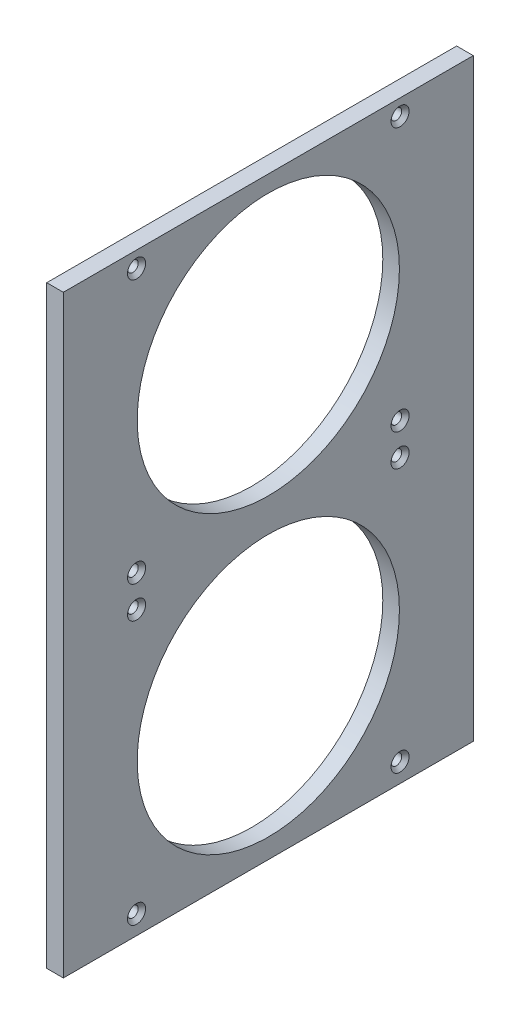
ISO-10303-21;
HEADER;
FILE_DESCRIPTION(('STEP AP214'),'2;1');
FILE_NAME('part.step','',(''),(''),'','','');
FILE_SCHEMA(('AUTOMOTIVE_DESIGN { 1 0 10303 214 1 1 1 1 }'));
ENDSEC;
DATA;
#1=APPLICATION_CONTEXT('core data for automotive mechanical design processes');
#2=APPLICATION_PROTOCOL_DEFINITION('international standard','automotive_design',2000,#1);
#3=PRODUCT_CONTEXT('',#1,'mechanical');
#4=PRODUCT('Part','Part','',(#3));
#5=PRODUCT_RELATED_PRODUCT_CATEGORY('part','',(#4));
#6=PRODUCT_DEFINITION_FORMATION('','',#4);
#7=PRODUCT_DEFINITION_CONTEXT('part definition',#1,'design');
#8=PRODUCT_DEFINITION('design','',#6,#7);
#9=PRODUCT_DEFINITION_SHAPE('','',#8);
#10=(LENGTH_UNIT() NAMED_UNIT(*) SI_UNIT(.MILLI.,.METRE.));
#11=(NAMED_UNIT(*) PLANE_ANGLE_UNIT() SI_UNIT($,.RADIAN.));
#12=(NAMED_UNIT(*) SI_UNIT($,.STERADIAN.) SOLID_ANGLE_UNIT());
#13=UNCERTAINTY_MEASURE_WITH_UNIT(LENGTH_MEASURE(1.E-05),#10,'distance_accuracy_value','');
#14=(GEOMETRIC_REPRESENTATION_CONTEXT(3) GLOBAL_UNCERTAINTY_ASSIGNED_CONTEXT((#13)) GLOBAL_UNIT_ASSIGNED_CONTEXT((#10,
#11,#12)) REPRESENTATION_CONTEXT('',''));
#15=CARTESIAN_POINT('',(0.,0.,0.));
#16=DIRECTION('',(0.,0.,1.));
#17=DIRECTION('',(1.,0.,0.));
#18=AXIS2_PLACEMENT_3D('',#15,#16,#17);
#19=CARTESIAN_POINT('',(83.25,91.5,-55.5));
#20=DIRECTION('',(-1.,0.,0.));
#21=DIRECTION('',(0.,0.,1.));
#22=AXIS2_PLACEMENT_3D('',#19,#20,#21);
#23=PLANE('',#22);
#24=CARTESIAN_POINT('',(83.25,88.325,35.675));
#25=DIRECTION('',(-1.,0.,0.));
#26=DIRECTION('',(0.,0.,1.));
#27=AXIS2_PLACEMENT_3D('',#24,#25,#26);
#28=CIRCLE('',#27,2.45033999999982);
#29=CARTESIAN_POINT('',(83.25,88.325,38.1253399999998));
#30=VERTEX_POINT('',#29);
#31=EDGE_CURVE('E213',#30,#30,#28,.T.);
#32=ORIENTED_EDGE('',*,*,#31,.T.);
#33=EDGE_LOOP('',(#32));
#34=FACE_BOUND('',#33,.T.);
#35=CARTESIAN_POINT('',(83.25,88.325,-35.675));
#36=DIRECTION('',(-1.,0.,0.));
#37=DIRECTION('',(0.,0.,1.));
#38=AXIS2_PLACEMENT_3D('',#35,#36,#37);
#39=CIRCLE('',#38,2.45033999999984);
#40=CARTESIAN_POINT('',(83.25,88.325,-33.2246600000002));
#41=VERTEX_POINT('',#40);
#42=EDGE_CURVE('E209',#41,#41,#39,.T.);
#43=ORIENTED_EDGE('',*,*,#42,.T.);
#44=EDGE_LOOP('',(#43));
#45=FACE_BOUND('',#44,.T.);
#46=CARTESIAN_POINT('',(83.25,159.675,-35.675));
#47=DIRECTION('',(-1.,0.,0.));
#48=DIRECTION('',(0.,0.,1.));
#49=AXIS2_PLACEMENT_3D('',#46,#47,#48);
#50=CIRCLE('',#49,2.45033999999984);
#51=CARTESIAN_POINT('',(83.25,159.675,-33.2246600000002));
#52=VERTEX_POINT('',#51);
#53=EDGE_CURVE('E205',#52,#52,#50,.T.);
#54=ORIENTED_EDGE('',*,*,#53,.T.);
#55=EDGE_LOOP('',(#54));
#56=FACE_BOUND('',#55,.T.);
#57=CARTESIAN_POINT('',(83.25,168.325,-35.675));
#58=DIRECTION('',(-1.,0.,0.));
#59=DIRECTION('',(0.,0.,1.));
#60=AXIS2_PLACEMENT_3D('',#57,#58,#59);
#61=CIRCLE('',#60,2.45033999999984);
#62=CARTESIAN_POINT('',(83.25,168.325,-33.2246600000002));
#63=VERTEX_POINT('',#62);
#64=EDGE_CURVE('E201',#63,#63,#61,.T.);
#65=ORIENTED_EDGE('',*,*,#64,.T.);
#66=EDGE_LOOP('',(#65));
#67=FACE_BOUND('',#66,.T.);
#68=CARTESIAN_POINT('',(83.25,159.675,35.675));
#69=DIRECTION('',(-1.,0.,0.));
#70=DIRECTION('',(0.,0.,1.));
#71=AXIS2_PLACEMENT_3D('',#68,#69,#70);
#72=CIRCLE('',#71,2.45033999999982);
#73=CARTESIAN_POINT('',(83.25,159.675,38.1253399999998));
#74=VERTEX_POINT('',#73);
#75=EDGE_CURVE('E197',#74,#74,#72,.T.);
#76=ORIENTED_EDGE('',*,*,#75,.T.);
#77=EDGE_LOOP('',(#76));
#78=FACE_BOUND('',#77,.T.);
#79=CARTESIAN_POINT('',(83.25,168.325,35.675));
#80=DIRECTION('',(-1.,0.,0.));
#81=DIRECTION('',(0.,0.,1.));
#82=AXIS2_PLACEMENT_3D('',#79,#80,#81);
#83=CIRCLE('',#82,2.45033999999982);
#84=CARTESIAN_POINT('',(83.25,168.325,38.1253399999998));
#85=VERTEX_POINT('',#84);
#86=EDGE_CURVE('E193',#85,#85,#83,.T.);
#87=ORIENTED_EDGE('',*,*,#86,.T.);
#88=EDGE_LOOP('',(#87));
#89=FACE_BOUND('',#88,.T.);
#90=CARTESIAN_POINT('',(83.25,239.675,-35.675));
#91=DIRECTION('',(-1.,0.,0.));
#92=DIRECTION('',(0.,0.,1.));
#93=AXIS2_PLACEMENT_3D('',#90,#91,#92);
#94=CIRCLE('',#93,2.45033999999984);
#95=CARTESIAN_POINT('',(83.25,239.675,-33.2246600000002));
#96=VERTEX_POINT('',#95);
#97=EDGE_CURVE('E189',#96,#96,#94,.T.);
#98=ORIENTED_EDGE('',*,*,#97,.T.);
#99=EDGE_LOOP('',(#98));
#100=FACE_BOUND('',#99,.T.);
#101=CARTESIAN_POINT('',(83.25,239.675,35.675));
#102=DIRECTION('',(-1.,0.,0.));
#103=DIRECTION('',(0.,0.,1.));
#104=AXIS2_PLACEMENT_3D('',#101,#102,#103);
#105=CIRCLE('',#104,2.45033999999982);
#106=CARTESIAN_POINT('',(83.25,239.675,38.1253399999998));
#107=VERTEX_POINT('',#106);
#108=EDGE_CURVE('E185',#107,#107,#105,.T.);
#109=ORIENTED_EDGE('',*,*,#108,.T.);
#110=EDGE_LOOP('',(#109));
#111=FACE_BOUND('',#110,.T.);
#112=DIRECTION('',(0.,-1.,0.));
#113=VECTOR('',#112,1.);
#114=CARTESIAN_POINT('',(83.25,91.5,55.5));
#115=LINE('',#114,#113);
#116=CARTESIAN_POINT('',(83.25,244.,55.5));
#117=VERTEX_POINT('',#116);
#118=CARTESIAN_POINT('',(83.25,83.1961640996338,55.5));
#119=VERTEX_POINT('',#118);
#120=EDGE_CURVE('E179',#117,#119,#115,.T.);
#121=ORIENTED_EDGE('',*,*,#120,.T.);
#122=DIRECTION('',(0.,0.,-1.));
#123=VECTOR('',#122,1.);
#124=CARTESIAN_POINT('',(83.25,83.1961640996338,-55.5));
#125=LINE('',#124,#123);
#126=CARTESIAN_POINT('',(83.25,83.1961640996338,-55.5));
#127=VERTEX_POINT('',#126);
#128=EDGE_CURVE('E122',#119,#127,#125,.T.);
#129=ORIENTED_EDGE('',*,*,#128,.T.);
#130=DIRECTION('',(0.,-1.,0.));
#131=VECTOR('',#130,1.);
#132=CARTESIAN_POINT('',(83.25,91.5,-55.5));
#133=LINE('',#132,#131);
#134=CARTESIAN_POINT('',(83.25,244.,-55.5));
#135=VERTEX_POINT('',#134);
#136=EDGE_CURVE('E106',#135,#127,#133,.T.);
#137=ORIENTED_EDGE('',*,*,#136,.F.);
#138=DIRECTION('',(0.,0.,-1.));
#139=VECTOR('',#138,1.);
#140=CARTESIAN_POINT('',(83.25,244.,-55.5));
#141=LINE('',#140,#139);
#142=EDGE_CURVE('E171',#117,#135,#141,.T.);
#143=ORIENTED_EDGE('',*,*,#142,.F.);
#144=EDGE_LOOP('',(#121,#129,#137,#143));
#145=FACE_BOUND('',#144,.T.);
#146=CARTESIAN_POINT('',(83.25,204.,0.));
#147=DIRECTION('',(1.,0.,0.));
#148=DIRECTION('',(0.,0.,-1.));
#149=AXIS2_PLACEMENT_3D('',#146,#147,#148);
#150=CIRCLE('',#149,35.5);
#151=CARTESIAN_POINT('',(83.25,204.,-35.5));
#152=VERTEX_POINT('',#151);
#153=EDGE_CURVE('E154',#152,#152,#150,.T.);
#154=ORIENTED_EDGE('',*,*,#153,.F.);
#155=EDGE_LOOP('',(#154));
#156=FACE_BOUND('',#155,.T.);
#157=CARTESIAN_POINT('',(83.25,124.,0.));
#158=DIRECTION('',(1.,0.,0.));
#159=DIRECTION('',(0.,0.,-1.));
#160=AXIS2_PLACEMENT_3D('',#157,#158,#159);
#161=CIRCLE('',#160,35.5);
#162=CARTESIAN_POINT('',(83.25,124.,-35.5));
#163=VERTEX_POINT('',#162);
#164=EDGE_CURVE('E162',#163,#163,#161,.T.);
#165=ORIENTED_EDGE('',*,*,#164,.F.);
#166=EDGE_LOOP('',(#165));
#167=FACE_BOUND('',#166,.T.);
#168=ADVANCED_FACE('F48',(#34,#45,#56,#67,#78,#89,#100,#111,#145,#156,#167),#23,.F.);
#169=CARTESIAN_POINT('',(-83.25,91.5,-55.5));
#170=DIRECTION('',(0.,0.,1.));
#171=DIRECTION('',(1.,0.,0.));
#172=AXIS2_PLACEMENT_3D('',#169,#170,#171);
#173=PLANE('',#172);
#174=ORIENTED_EDGE('',*,*,#136,.T.);
#175=DIRECTION('',(1.,0.,0.));
#176=VECTOR('',#175,1.);
#177=CARTESIAN_POINT('',(78.7499999999999,83.1961640996338,-55.5));
#178=LINE('',#177,#176);
#179=CARTESIAN_POINT('',(78.7499999999999,83.1961640996338,-55.5));
#180=VERTEX_POINT('',#179);
#181=EDGE_CURVE('E92',#180,#127,#178,.T.);
#182=ORIENTED_EDGE('',*,*,#181,.F.);
#183=DIRECTION('',(0.,1.,0.));
#184=VECTOR('',#183,1.);
#185=CARTESIAN_POINT('',(78.75,91.5,-55.5));
#186=LINE('',#185,#184);
#187=CARTESIAN_POINT('',(78.75,244.,-55.5));
#188=VERTEX_POINT('',#187);
#189=EDGE_CURVE('E104',#180,#188,#186,.T.);
#190=ORIENTED_EDGE('',*,*,#189,.T.);
#191=DIRECTION('',(-1.,0.,0.));
#192=VECTOR('',#191,1.);
#193=CARTESIAN_POINT('',(-83.25,244.,-55.5));
#194=LINE('',#193,#192);
#195=EDGE_CURVE('E174',#135,#188,#194,.T.);
#196=ORIENTED_EDGE('',*,*,#195,.F.);
#197=EDGE_LOOP('',(#174,#182,#190,#196));
#198=FACE_BOUND('',#197,.T.);
#199=ADVANCED_FACE('F102',(#198),#173,.F.);
#200=CARTESIAN_POINT('',(-83.25,91.5,55.5));
#201=DIRECTION('',(0.,0.,-1.));
#202=DIRECTION('',(-1.,0.,0.));
#203=AXIS2_PLACEMENT_3D('',#200,#201,#202);
#204=PLANE('',#203);
#205=DIRECTION('',(0.,-1.,0.));
#206=VECTOR('',#205,1.);
#207=CARTESIAN_POINT('',(78.75,244.,55.5));
#208=LINE('',#207,#206);
#209=CARTESIAN_POINT('',(78.75,244.,55.5));
#210=VERTEX_POINT('',#209);
#211=CARTESIAN_POINT('',(78.75,83.1961640996339,55.5));
#212=VERTEX_POINT('',#211);
#213=EDGE_CURVE('E115',#210,#212,#208,.T.);
#214=ORIENTED_EDGE('',*,*,#213,.T.);
#215=DIRECTION('',(1.,0.,0.));
#216=VECTOR('',#215,1.);
#217=CARTESIAN_POINT('',(78.7499999999999,83.1961640996338,55.5));
#218=LINE('',#217,#216);
#219=EDGE_CURVE('E65',#212,#119,#218,.T.);
#220=ORIENTED_EDGE('',*,*,#219,.T.);
#221=ORIENTED_EDGE('',*,*,#120,.F.);
#222=DIRECTION('',(1.,0.,0.));
#223=VECTOR('',#222,1.);
#224=CARTESIAN_POINT('',(-83.25,244.,55.5));
#225=LINE('',#224,#223);
#226=EDGE_CURVE('E73',#210,#117,#225,.T.);
#227=ORIENTED_EDGE('',*,*,#226,.F.);
#228=EDGE_LOOP('',(#214,#220,#221,#227));
#229=FACE_BOUND('',#228,.T.);
#230=ADVANCED_FACE('F269',(#229),#204,.F.);
#231=CARTESIAN_POINT('',(78.75,91.5,-55.5));
#232=DIRECTION('',(-1.,0.,0.));
#233=DIRECTION('',(0.,0.,1.));
#234=AXIS2_PLACEMENT_3D('',#231,#232,#233);
#235=PLANE('',#234);
#236=DIRECTION('',(0.,0.,1.));
#237=VECTOR('',#236,1.);
#238=CARTESIAN_POINT('',(78.7499999999999,83.1961640996338,-55.5));
#239=LINE('',#238,#237);
#240=EDGE_CURVE('E89',#180,#212,#239,.T.);
#241=ORIENTED_EDGE('',*,*,#240,.T.);
#242=ORIENTED_EDGE('',*,*,#213,.F.);
#243=DIRECTION('',(0.,0.,-1.));
#244=VECTOR('',#243,1.);
#245=CARTESIAN_POINT('',(78.75,244.,-55.5));
#246=LINE('',#245,#244);
#247=EDGE_CURVE('E111',#210,#188,#246,.T.);
#248=ORIENTED_EDGE('',*,*,#247,.T.);
#249=ORIENTED_EDGE('',*,*,#189,.F.);
#250=EDGE_LOOP('',(#241,#242,#248,#249));
#251=FACE_BOUND('',#250,.T.);
#252=CARTESIAN_POINT('',(78.75,88.325,35.675));
#253=DIRECTION('',(-1.,0.,0.));
#254=DIRECTION('',(0.,0.,1.));
#255=AXIS2_PLACEMENT_3D('',#252,#253,#254);
#256=CIRCLE('',#255,1.45033999999999);
#257=CARTESIAN_POINT('',(78.75,88.325,37.12534));
#258=VERTEX_POINT('',#257);
#259=EDGE_CURVE('E114',#258,#258,#256,.T.);
#260=ORIENTED_EDGE('',*,*,#259,.F.);
#261=EDGE_LOOP('',(#260));
#262=FACE_BOUND('',#261,.T.);
#263=CARTESIAN_POINT('',(78.75,88.325,-35.675));
#264=DIRECTION('',(-1.,0.,0.));
#265=DIRECTION('',(0.,0.,1.));
#266=AXIS2_PLACEMENT_3D('',#263,#264,#265);
#267=CIRCLE('',#266,1.45033999999999);
#268=CARTESIAN_POINT('',(78.75,88.325,-34.22466));
#269=VERTEX_POINT('',#268);
#270=EDGE_CURVE('E120',#269,#269,#267,.T.);
#271=ORIENTED_EDGE('',*,*,#270,.F.);
#272=EDGE_LOOP('',(#271));
#273=FACE_BOUND('',#272,.T.);
#274=CARTESIAN_POINT('',(78.75,159.675,-35.675));
#275=DIRECTION('',(-1.,0.,0.));
#276=DIRECTION('',(0.,0.,1.));
#277=AXIS2_PLACEMENT_3D('',#274,#275,#276);
#278=CIRCLE('',#277,1.45033999999999);
#279=CARTESIAN_POINT('',(78.75,159.675,-34.22466));
#280=VERTEX_POINT('',#279);
#281=EDGE_CURVE('E129',#280,#280,#278,.T.);
#282=ORIENTED_EDGE('',*,*,#281,.F.);
#283=EDGE_LOOP('',(#282));
#284=FACE_BOUND('',#283,.T.);
#285=CARTESIAN_POINT('',(78.75,159.675,35.675));
#286=DIRECTION('',(-1.,0.,0.));
#287=DIRECTION('',(0.,0.,1.));
#288=AXIS2_PLACEMENT_3D('',#285,#286,#287);
#289=CIRCLE('',#288,1.45033999999999);
#290=CARTESIAN_POINT('',(78.75,159.675,37.12534));
#291=VERTEX_POINT('',#290);
#292=EDGE_CURVE('E133',#291,#291,#289,.T.);
#293=ORIENTED_EDGE('',*,*,#292,.F.);
#294=EDGE_LOOP('',(#293));
#295=FACE_BOUND('',#294,.T.);
#296=CARTESIAN_POINT('',(78.75,239.675,35.675));
#297=DIRECTION('',(-1.,0.,0.));
#298=DIRECTION('',(0.,0.,1.));
#299=AXIS2_PLACEMENT_3D('',#296,#297,#298);
#300=CIRCLE('',#299,1.45033999999999);
#301=CARTESIAN_POINT('',(78.75,239.675,37.12534));
#302=VERTEX_POINT('',#301);
#303=EDGE_CURVE('E137',#302,#302,#300,.T.);
#304=ORIENTED_EDGE('',*,*,#303,.F.);
#305=EDGE_LOOP('',(#304));
#306=FACE_BOUND('',#305,.T.);
#307=CARTESIAN_POINT('',(78.75,239.675,-35.675));
#308=DIRECTION('',(-1.,0.,0.));
#309=DIRECTION('',(0.,0.,1.));
#310=AXIS2_PLACEMENT_3D('',#307,#308,#309);
#311=CIRCLE('',#310,1.45033999999999);
#312=CARTESIAN_POINT('',(78.75,239.675,-34.22466));
#313=VERTEX_POINT('',#312);
#314=EDGE_CURVE('E141',#313,#313,#311,.T.);
#315=ORIENTED_EDGE('',*,*,#314,.F.);
#316=EDGE_LOOP('',(#315));
#317=FACE_BOUND('',#316,.T.);
#318=CARTESIAN_POINT('',(78.75,168.325,-35.675));
#319=DIRECTION('',(-1.,0.,0.));
#320=DIRECTION('',(0.,0.,1.));
#321=AXIS2_PLACEMENT_3D('',#318,#319,#320);
#322=CIRCLE('',#321,1.45033999999999);
#323=CARTESIAN_POINT('',(78.75,168.325,-34.22466));
#324=VERTEX_POINT('',#323);
#325=EDGE_CURVE('E145',#324,#324,#322,.T.);
#326=ORIENTED_EDGE('',*,*,#325,.F.);
#327=EDGE_LOOP('',(#326));
#328=FACE_BOUND('',#327,.T.);
#329=CARTESIAN_POINT('',(78.75,168.325,35.675));
#330=DIRECTION('',(-1.,0.,0.));
#331=DIRECTION('',(0.,0.,1.));
#332=AXIS2_PLACEMENT_3D('',#329,#330,#331);
#333=CIRCLE('',#332,1.45033999999999);
#334=CARTESIAN_POINT('',(78.75,168.325,37.12534));
#335=VERTEX_POINT('',#334);
#336=EDGE_CURVE('E149',#335,#335,#333,.T.);
#337=ORIENTED_EDGE('',*,*,#336,.F.);
#338=EDGE_LOOP('',(#337));
#339=FACE_BOUND('',#338,.T.);
#340=CARTESIAN_POINT('',(78.75,204.,0.));
#341=DIRECTION('',(-1.,0.,0.));
#342=DIRECTION('',(0.,0.,1.));
#343=AXIS2_PLACEMENT_3D('',#340,#341,#342);
#344=CIRCLE('',#343,35.5);
#345=CARTESIAN_POINT('',(78.75,204.,35.5));
#346=VERTEX_POINT('',#345);
#347=EDGE_CURVE('E158',#346,#346,#344,.F.);
#348=ORIENTED_EDGE('',*,*,#347,.T.);
#349=EDGE_LOOP('',(#348));
#350=FACE_BOUND('',#349,.T.);
#351=CARTESIAN_POINT('',(78.75,124.,0.));
#352=DIRECTION('',(-1.,0.,0.));
#353=DIRECTION('',(0.,0.,1.));
#354=AXIS2_PLACEMENT_3D('',#351,#352,#353);
#355=CIRCLE('',#354,35.5);
#356=CARTESIAN_POINT('',(78.75,124.,35.5));
#357=VERTEX_POINT('',#356);
#358=EDGE_CURVE('E153',#357,#357,#355,.F.);
#359=ORIENTED_EDGE('',*,*,#358,.T.);
#360=EDGE_LOOP('',(#359));
#361=FACE_BOUND('',#360,.T.);
#362=ADVANCED_FACE('F109',(#251,#262,#273,#284,#295,#306,#317,#328,#339,#350,#361),#235,.T.);
#363=CARTESIAN_POINT('',(0.,244.,0.));
#364=DIRECTION('',(0.,1.,0.));
#365=DIRECTION('',(0.,0.,1.));
#366=AXIS2_PLACEMENT_3D('',#363,#364,#365);
#367=PLANE('',#366);
#368=ORIENTED_EDGE('',*,*,#247,.F.);
#369=ORIENTED_EDGE('',*,*,#226,.T.);
#370=ORIENTED_EDGE('',*,*,#142,.T.);
#371=ORIENTED_EDGE('',*,*,#195,.T.);
#372=EDGE_LOOP('',(#368,#369,#370,#371));
#373=FACE_BOUND('',#372,.T.);
#374=ADVANCED_FACE('F331',(#373),#367,.T.);
#375=CARTESIAN_POINT('',(-83.251,124.,0.));
#376=DIRECTION('',(1.,0.,0.));
#377=DIRECTION('',(0.,0.,-1.));
#378=AXIS2_PLACEMENT_3D('',#375,#376,#377);
#379=CYLINDRICAL_SURFACE('',#378,35.5);
#380=ORIENTED_EDGE('',*,*,#358,.F.);
#381=EDGE_LOOP('',(#380));
#382=FACE_BOUND('',#381,.T.);
#383=ORIENTED_EDGE('',*,*,#164,.T.);
#384=EDGE_LOOP('',(#383));
#385=FACE_BOUND('',#384,.T.);
#386=ADVANCED_FACE('F345',(#382,#385),#379,.F.);
#387=CARTESIAN_POINT('',(-83.251,204.,0.));
#388=DIRECTION('',(1.,0.,0.));
#389=DIRECTION('',(0.,0.,-1.));
#390=AXIS2_PLACEMENT_3D('',#387,#388,#389);
#391=CYLINDRICAL_SURFACE('',#390,35.5);
#392=ORIENTED_EDGE('',*,*,#347,.F.);
#393=EDGE_LOOP('',(#392));
#394=FACE_BOUND('',#393,.T.);
#395=ORIENTED_EDGE('',*,*,#153,.T.);
#396=EDGE_LOOP('',(#395));
#397=FACE_BOUND('',#396,.T.);
#398=ADVANCED_FACE('F348',(#394,#397),#391,.F.);
#399=CARTESIAN_POINT('',(83.25,168.325,35.675));
#400=DIRECTION('',(1.,0.,0.));
#401=DIRECTION('',(0.,0.,-1.));
#402=AXIS2_PLACEMENT_3D('',#399,#400,#401);
#403=CYLINDRICAL_SURFACE('',#402,1.45033999999999);
#404=CARTESIAN_POINT('',(82.2500000000002,168.325,35.675));
#405=DIRECTION('',(-1.,0.,0.));
#406=DIRECTION('',(0.,0.,1.));
#407=AXIS2_PLACEMENT_3D('',#404,#405,#406);
#408=CIRCLE('',#407,1.45033999999999);
#409=CARTESIAN_POINT('',(82.2500000000002,168.325,37.12534));
#410=VERTEX_POINT('',#409);
#411=EDGE_CURVE('E237',#410,#410,#408,.F.);
#412=ORIENTED_EDGE('',*,*,#411,.T.);
#413=EDGE_LOOP('',(#412));
#414=FACE_BOUND('',#413,.T.);
#415=ORIENTED_EDGE('',*,*,#336,.T.);
#416=EDGE_LOOP('',(#415));
#417=FACE_BOUND('',#416,.T.);
#418=ADVANCED_FACE('F356',(#414,#417),#403,.F.);
#419=CARTESIAN_POINT('',(83.25,168.325,-35.675));
#420=DIRECTION('',(1.,0.,0.));
#421=DIRECTION('',(0.,0.,-1.));
#422=AXIS2_PLACEMENT_3D('',#419,#420,#421);
#423=CYLINDRICAL_SURFACE('',#422,1.45033999999999);
#424=CARTESIAN_POINT('',(82.2500000000002,168.325,-35.675));
#425=DIRECTION('',(-1.,0.,0.));
#426=DIRECTION('',(0.,0.,1.));
#427=AXIS2_PLACEMENT_3D('',#424,#425,#426);
#428=CIRCLE('',#427,1.45033999999999);
#429=CARTESIAN_POINT('',(82.2500000000002,168.325,-34.22466));
#430=VERTEX_POINT('',#429);
#431=EDGE_CURVE('E229',#430,#430,#428,.F.);
#432=ORIENTED_EDGE('',*,*,#431,.T.);
#433=EDGE_LOOP('',(#432));
#434=FACE_BOUND('',#433,.T.);
#435=ORIENTED_EDGE('',*,*,#325,.T.);
#436=EDGE_LOOP('',(#435));
#437=FACE_BOUND('',#436,.T.);
#438=ADVANCED_FACE('F471',(#434,#437),#423,.F.);
#439=CARTESIAN_POINT('',(83.25,239.675,-35.675));
#440=DIRECTION('',(1.,0.,0.));
#441=DIRECTION('',(0.,0.,-1.));
#442=AXIS2_PLACEMENT_3D('',#439,#440,#441);
#443=CYLINDRICAL_SURFACE('',#442,1.45033999999999);
#444=CARTESIAN_POINT('',(82.2500000000002,239.675,-35.675));
#445=DIRECTION('',(-1.,0.,0.));
#446=DIRECTION('',(0.,0.,1.));
#447=AXIS2_PLACEMENT_3D('',#444,#445,#446);
#448=CIRCLE('',#447,1.45033999999999);
#449=CARTESIAN_POINT('',(82.2500000000002,239.675,-34.22466));
#450=VERTEX_POINT('',#449);
#451=EDGE_CURVE('E58',#450,#450,#448,.F.);
#452=ORIENTED_EDGE('',*,*,#451,.T.);
#453=EDGE_LOOP('',(#452));
#454=FACE_BOUND('',#453,.T.);
#455=ORIENTED_EDGE('',*,*,#314,.T.);
#456=EDGE_LOOP('',(#455));
#457=FACE_BOUND('',#456,.T.);
#458=ADVANCED_FACE('F244',(#454,#457),#443,.F.);
#459=CARTESIAN_POINT('',(83.25,239.675,35.675));
#460=DIRECTION('',(1.,0.,0.));
#461=DIRECTION('',(0.,0.,-1.));
#462=AXIS2_PLACEMENT_3D('',#459,#460,#461);
#463=CYLINDRICAL_SURFACE('',#462,1.45033999999999);
#464=CARTESIAN_POINT('',(82.2500000000002,239.675,35.675));
#465=DIRECTION('',(-1.,0.,0.));
#466=DIRECTION('',(0.,0.,1.));
#467=AXIS2_PLACEMENT_3D('',#464,#465,#466);
#468=CIRCLE('',#467,1.45033999999999);
#469=CARTESIAN_POINT('',(82.2500000000002,239.675,37.12534));
#470=VERTEX_POINT('',#469);
#471=EDGE_CURVE('E11',#470,#470,#468,.F.);
#472=ORIENTED_EDGE('',*,*,#471,.T.);
#473=EDGE_LOOP('',(#472));
#474=FACE_BOUND('',#473,.T.);
#475=ORIENTED_EDGE('',*,*,#303,.T.);
#476=EDGE_LOOP('',(#475));
#477=FACE_BOUND('',#476,.T.);
#478=ADVANCED_FACE('F325',(#474,#477),#463,.F.);
#479=CARTESIAN_POINT('',(83.25,159.675,35.675));
#480=DIRECTION('',(1.,0.,0.));
#481=DIRECTION('',(0.,0.,-1.));
#482=AXIS2_PLACEMENT_3D('',#479,#480,#481);
#483=CYLINDRICAL_SURFACE('',#482,1.45033999999999);
#484=CARTESIAN_POINT('',(82.2500000000002,159.675,35.675));
#485=DIRECTION('',(-1.,0.,0.));
#486=DIRECTION('',(0.,0.,1.));
#487=AXIS2_PLACEMENT_3D('',#484,#485,#486);
#488=CIRCLE('',#487,1.45033999999999);
#489=CARTESIAN_POINT('',(82.2500000000002,159.675,37.12534));
#490=VERTEX_POINT('',#489);
#491=EDGE_CURVE('E233',#490,#490,#488,.F.);
#492=ORIENTED_EDGE('',*,*,#491,.T.);
#493=EDGE_LOOP('',(#492));
#494=FACE_BOUND('',#493,.T.);
#495=ORIENTED_EDGE('',*,*,#292,.T.);
#496=EDGE_LOOP('',(#495));
#497=FACE_BOUND('',#496,.T.);
#498=ADVANCED_FACE('F321',(#494,#497),#483,.F.);
#499=CARTESIAN_POINT('',(83.25,159.675,-35.675));
#500=DIRECTION('',(1.,0.,0.));
#501=DIRECTION('',(0.,0.,-1.));
#502=AXIS2_PLACEMENT_3D('',#499,#500,#501);
#503=CYLINDRICAL_SURFACE('',#502,1.45033999999999);
#504=CARTESIAN_POINT('',(82.2500000000002,159.675,-35.675));
#505=DIRECTION('',(-1.,0.,0.));
#506=DIRECTION('',(0.,0.,1.));
#507=AXIS2_PLACEMENT_3D('',#504,#505,#506);
#508=CIRCLE('',#507,1.45033999999999);
#509=CARTESIAN_POINT('',(82.2500000000002,159.675,-34.22466));
#510=VERTEX_POINT('',#509);
#511=EDGE_CURVE('E225',#510,#510,#508,.F.);
#512=ORIENTED_EDGE('',*,*,#511,.T.);
#513=EDGE_LOOP('',(#512));
#514=FACE_BOUND('',#513,.T.);
#515=ORIENTED_EDGE('',*,*,#281,.T.);
#516=EDGE_LOOP('',(#515));
#517=FACE_BOUND('',#516,.T.);
#518=ADVANCED_FACE('F324',(#514,#517),#503,.F.);
#519=CARTESIAN_POINT('',(83.25,88.325,-35.675));
#520=DIRECTION('',(1.,0.,0.));
#521=DIRECTION('',(0.,0.,-1.));
#522=AXIS2_PLACEMENT_3D('',#519,#520,#521);
#523=CYLINDRICAL_SURFACE('',#522,1.45033999999999);
#524=CARTESIAN_POINT('',(82.2500000000002,88.325,-35.675));
#525=DIRECTION('',(-1.,0.,0.));
#526=DIRECTION('',(0.,0.,1.));
#527=AXIS2_PLACEMENT_3D('',#524,#525,#526);
#528=CIRCLE('',#527,1.45033999999999);
#529=CARTESIAN_POINT('',(82.2500000000002,88.325,-34.22466));
#530=VERTEX_POINT('',#529);
#531=EDGE_CURVE('E221',#530,#530,#528,.F.);
#532=ORIENTED_EDGE('',*,*,#531,.T.);
#533=EDGE_LOOP('',(#532));
#534=FACE_BOUND('',#533,.T.);
#535=ORIENTED_EDGE('',*,*,#270,.T.);
#536=EDGE_LOOP('',(#535));
#537=FACE_BOUND('',#536,.T.);
#538=ADVANCED_FACE('F507',(#534,#537),#523,.F.);
#539=CARTESIAN_POINT('',(83.25,88.325,35.675));
#540=DIRECTION('',(1.,0.,0.));
#541=DIRECTION('',(0.,0.,-1.));
#542=AXIS2_PLACEMENT_3D('',#539,#540,#541);
#543=CYLINDRICAL_SURFACE('',#542,1.45033999999999);
#544=CARTESIAN_POINT('',(82.2500000000002,88.325,35.675));
#545=DIRECTION('',(-1.,0.,0.));
#546=DIRECTION('',(0.,0.,1.));
#547=AXIS2_PLACEMENT_3D('',#544,#545,#546);
#548=CIRCLE('',#547,1.45033999999999);
#549=CARTESIAN_POINT('',(82.2500000000002,88.325,37.12534));
#550=VERTEX_POINT('',#549);
#551=EDGE_CURVE('E217',#550,#550,#548,.F.);
#552=ORIENTED_EDGE('',*,*,#551,.T.);
#553=EDGE_LOOP('',(#552));
#554=FACE_BOUND('',#553,.T.);
#555=ORIENTED_EDGE('',*,*,#259,.T.);
#556=EDGE_LOOP('',(#555));
#557=FACE_BOUND('',#556,.T.);
#558=ADVANCED_FACE('F282',(#554,#557),#543,.F.);
#559=CARTESIAN_POINT('',(82.2500000000002,88.325,35.675));
#560=DIRECTION('',(1.,0.,0.));
#561=DIRECTION('',(0.,0.,-1.));
#562=AXIS2_PLACEMENT_3D('',#559,#560,#561);
#563=CONICAL_SURFACE('',#562,1.45033999999999,0.785398163397448);
#564=ORIENTED_EDGE('',*,*,#31,.F.);
#565=EDGE_LOOP('',(#564));
#566=FACE_BOUND('',#565,.T.);
#567=ORIENTED_EDGE('',*,*,#551,.F.);
#568=EDGE_LOOP('',(#567));
#569=FACE_BOUND('',#568,.T.);
#570=ADVANCED_FACE('F275',(#566,#569),#563,.F.);
#571=CARTESIAN_POINT('',(82.2500000000002,88.325,-35.675));
#572=DIRECTION('',(1.,0.,0.));
#573=DIRECTION('',(0.,0.,-1.));
#574=AXIS2_PLACEMENT_3D('',#571,#572,#573);
#575=CONICAL_SURFACE('',#574,1.45033999999999,0.785398163397448);
#576=ORIENTED_EDGE('',*,*,#42,.F.);
#577=EDGE_LOOP('',(#576));
#578=FACE_BOUND('',#577,.T.);
#579=ORIENTED_EDGE('',*,*,#531,.F.);
#580=EDGE_LOOP('',(#579));
#581=FACE_BOUND('',#580,.T.);
#582=ADVANCED_FACE('F281',(#578,#581),#575,.F.);
#583=CARTESIAN_POINT('',(82.2500000000002,159.675,-35.675));
#584=DIRECTION('',(1.,0.,0.));
#585=DIRECTION('',(0.,0.,-1.));
#586=AXIS2_PLACEMENT_3D('',#583,#584,#585);
#587=CONICAL_SURFACE('',#586,1.45033999999999,0.785398163397448);
#588=ORIENTED_EDGE('',*,*,#53,.F.);
#589=EDGE_LOOP('',(#588));
#590=FACE_BOUND('',#589,.T.);
#591=ORIENTED_EDGE('',*,*,#511,.F.);
#592=EDGE_LOOP('',(#591));
#593=FACE_BOUND('',#592,.T.);
#594=ADVANCED_FACE('F289',(#590,#593),#587,.F.);
#595=CARTESIAN_POINT('',(82.2500000000002,168.325,-35.675));
#596=DIRECTION('',(1.,0.,0.));
#597=DIRECTION('',(0.,0.,-1.));
#598=AXIS2_PLACEMENT_3D('',#595,#596,#597);
#599=CONICAL_SURFACE('',#598,1.45033999999999,0.785398163397448);
#600=ORIENTED_EDGE('',*,*,#64,.F.);
#601=EDGE_LOOP('',(#600));
#602=FACE_BOUND('',#601,.T.);
#603=ORIENTED_EDGE('',*,*,#431,.F.);
#604=EDGE_LOOP('',(#603));
#605=FACE_BOUND('',#604,.T.);
#606=ADVANCED_FACE('F296',(#602,#605),#599,.F.);
#607=CARTESIAN_POINT('',(82.2500000000002,159.675,35.675));
#608=DIRECTION('',(1.,0.,0.));
#609=DIRECTION('',(0.,0.,-1.));
#610=AXIS2_PLACEMENT_3D('',#607,#608,#609);
#611=CONICAL_SURFACE('',#610,1.45033999999999,0.785398163397448);
#612=ORIENTED_EDGE('',*,*,#75,.F.);
#613=EDGE_LOOP('',(#612));
#614=FACE_BOUND('',#613,.T.);
#615=ORIENTED_EDGE('',*,*,#491,.F.);
#616=EDGE_LOOP('',(#615));
#617=FACE_BOUND('',#616,.T.);
#618=ADVANCED_FACE('F256',(#614,#617),#611,.F.);
#619=CARTESIAN_POINT('',(82.2500000000002,168.325,35.675));
#620=DIRECTION('',(1.,0.,0.));
#621=DIRECTION('',(0.,0.,-1.));
#622=AXIS2_PLACEMENT_3D('',#619,#620,#621);
#623=CONICAL_SURFACE('',#622,1.45033999999999,0.785398163397448);
#624=ORIENTED_EDGE('',*,*,#86,.F.);
#625=EDGE_LOOP('',(#624));
#626=FACE_BOUND('',#625,.T.);
#627=ORIENTED_EDGE('',*,*,#411,.F.);
#628=EDGE_LOOP('',(#627));
#629=FACE_BOUND('',#628,.T.);
#630=ADVANCED_FACE('F249',(#626,#629),#623,.F.);
#631=CARTESIAN_POINT('',(82.2500000000002,239.675,-35.675));
#632=DIRECTION('',(1.,0.,0.));
#633=DIRECTION('',(0.,0.,-1.));
#634=AXIS2_PLACEMENT_3D('',#631,#632,#633);
#635=CONICAL_SURFACE('',#634,1.45033999999999,0.785398163397448);
#636=ORIENTED_EDGE('',*,*,#97,.F.);
#637=EDGE_LOOP('',(#636));
#638=FACE_BOUND('',#637,.T.);
#639=ORIENTED_EDGE('',*,*,#451,.F.);
#640=EDGE_LOOP('',(#639));
#641=FACE_BOUND('',#640,.T.);
#642=ADVANCED_FACE('F247',(#638,#641),#635,.F.);
#643=CARTESIAN_POINT('',(82.2500000000002,239.675,35.675));
#644=DIRECTION('',(1.,0.,0.));
#645=DIRECTION('',(0.,0.,-1.));
#646=AXIS2_PLACEMENT_3D('',#643,#644,#645);
#647=CONICAL_SURFACE('',#646,1.45033999999999,0.785398163397448);
#648=ORIENTED_EDGE('',*,*,#108,.F.);
#649=EDGE_LOOP('',(#648));
#650=FACE_BOUND('',#649,.T.);
#651=ORIENTED_EDGE('',*,*,#471,.F.);
#652=EDGE_LOOP('',(#651));
#653=FACE_BOUND('',#652,.T.);
#654=ADVANCED_FACE('F51',(#650,#653),#647,.F.);
#655=CARTESIAN_POINT('',(78.7499999999999,83.1961640996338,-55.5));
#656=DIRECTION('',(0.,1.,0.));
#657=DIRECTION('',(0.,0.,1.));
#658=AXIS2_PLACEMENT_3D('',#655,#656,#657);
#659=PLANE('',#658);
#660=ORIENTED_EDGE('',*,*,#219,.F.);
#661=ORIENTED_EDGE('',*,*,#240,.F.);
#662=ORIENTED_EDGE('',*,*,#181,.T.);
#663=ORIENTED_EDGE('',*,*,#128,.F.);
#664=EDGE_LOOP('',(#660,#661,#662,#663));
#665=FACE_BOUND('',#664,.T.);
#666=ADVANCED_FACE('F91',(#665),#659,.F.);
#667=CLOSED_SHELL('',(#168,#199,#230,#362,#374,#386,#398,#418,#438,#458,#478,#498,#518,#538,
#558,#570,#582,#594,#606,#618,#630,#642,#654,#666));
#668=MANIFOLD_SOLID_BREP('B2',#667);
#669=ADVANCED_BREP_SHAPE_REPRESENTATION('',(#18,#668),#14);
#670=SHAPE_DEFINITION_REPRESENTATION(#9,#669);
ENDSEC;
END-ISO-10303-21;
